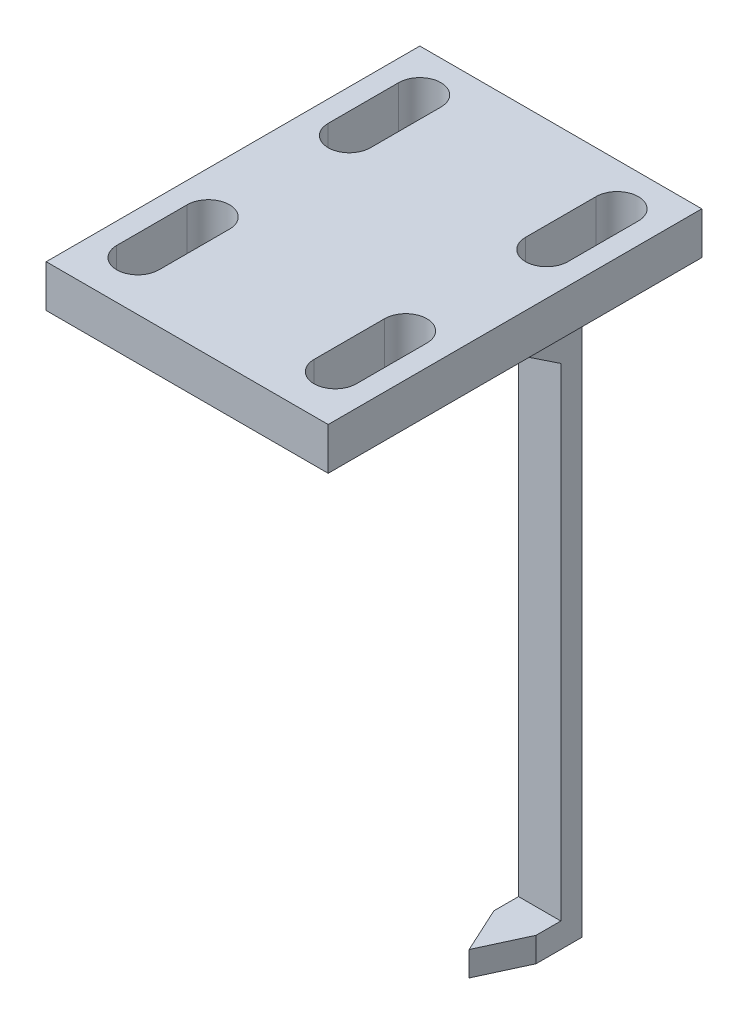
ISO-10303-21;
HEADER;
FILE_DESCRIPTION(('STEP AP214'),'2;1');
FILE_NAME('part.step','',(''),(''),'','','');
FILE_SCHEMA(('AUTOMOTIVE_DESIGN { 1 0 10303 214 1 1 1 1 }'));
ENDSEC;
DATA;
#1=APPLICATION_CONTEXT('core data for automotive mechanical design processes');
#2=APPLICATION_PROTOCOL_DEFINITION('international standard','automotive_design',2000,#1);
#3=PRODUCT_CONTEXT('',#1,'mechanical');
#4=PRODUCT('Part','Part','',(#3));
#5=PRODUCT_RELATED_PRODUCT_CATEGORY('part','',(#4));
#6=PRODUCT_DEFINITION_FORMATION('','',#4);
#7=PRODUCT_DEFINITION_CONTEXT('part definition',#1,'design');
#8=PRODUCT_DEFINITION('design','',#6,#7);
#9=PRODUCT_DEFINITION_SHAPE('','',#8);
#10=(LENGTH_UNIT() NAMED_UNIT(*) SI_UNIT(.MILLI.,.METRE.));
#11=(NAMED_UNIT(*) PLANE_ANGLE_UNIT() SI_UNIT($,.RADIAN.));
#12=(NAMED_UNIT(*) SI_UNIT($,.STERADIAN.) SOLID_ANGLE_UNIT());
#13=UNCERTAINTY_MEASURE_WITH_UNIT(LENGTH_MEASURE(1.E-05),#10,'distance_accuracy_value','');
#14=(GEOMETRIC_REPRESENTATION_CONTEXT(3) GLOBAL_UNCERTAINTY_ASSIGNED_CONTEXT((#13)) GLOBAL_UNIT_ASSIGNED_CONTEXT((#10,
#11,#12)) REPRESENTATION_CONTEXT('',''));
#15=CARTESIAN_POINT('',(0.,0.,0.));
#16=DIRECTION('',(0.,0.,1.));
#17=DIRECTION('',(1.,0.,0.));
#18=AXIS2_PLACEMENT_3D('',#15,#16,#17);
#19=CARTESIAN_POINT('',(-8.5,46.,1.5));
#20=DIRECTION('',(0.,1.,0.));
#21=DIRECTION('',(0.,0.,1.));
#22=AXIS2_PLACEMENT_3D('',#19,#20,#21);
#23=PLANE('',#22);
#24=DIRECTION('',(0.,0.,-1.));
#25=VECTOR('',#24,1.);
#26=CARTESIAN_POINT('',(7.,46.,8.));
#27=LINE('',#26,#25);
#28=CARTESIAN_POINT('',(7.,46.,8.));
#29=VERTEX_POINT('',#28);
#30=CARTESIAN_POINT('',(7.,46.,3.));
#31=VERTEX_POINT('',#30);
#32=EDGE_CURVE('E367',#29,#31,#27,.T.);
#33=ORIENTED_EDGE('',*,*,#32,.F.);
#34=CARTESIAN_POINT('',(8.5,46.,8.));
#35=DIRECTION('',(0.,-1.,0.));
#36=DIRECTION('',(0.,0.,-1.));
#37=AXIS2_PLACEMENT_3D('',#34,#35,#36);
#38=CIRCLE('',#37,1.5);
#39=CARTESIAN_POINT('',(10.,46.,8.));
#40=VERTEX_POINT('',#39);
#41=EDGE_CURVE('E370',#40,#29,#38,.T.);
#42=ORIENTED_EDGE('',*,*,#41,.F.);
#43=DIRECTION('',(0.,0.,1.));
#44=VECTOR('',#43,1.);
#45=CARTESIAN_POINT('',(10.,46.,8.));
#46=LINE('',#45,#44);
#47=CARTESIAN_POINT('',(10.,46.,3.));
#48=VERTEX_POINT('',#47);
#49=EDGE_CURVE('E357',#48,#40,#46,.T.);
#50=ORIENTED_EDGE('',*,*,#49,.F.);
#51=CARTESIAN_POINT('',(8.5,46.,3.));
#52=DIRECTION('',(0.,-1.,0.));
#53=DIRECTION('',(0.,0.,-1.));
#54=AXIS2_PLACEMENT_3D('',#51,#52,#53);
#55=CIRCLE('',#54,1.5);
#56=EDGE_CURVE('E364',#31,#48,#55,.T.);
#57=ORIENTED_EDGE('',*,*,#56,.F.);
#58=EDGE_LOOP('',(#33,#42,#50,#57));
#59=FACE_BOUND('',#58,.T.);
#60=DIRECTION('',(0.,0.,-1.));
#61=VECTOR('',#60,1.);
#62=CARTESIAN_POINT('',(-7.00000000000006,46.,23.));
#63=LINE('',#62,#61);
#64=CARTESIAN_POINT('',(-7.00000000000006,46.,23.));
#65=VERTEX_POINT('',#64);
#66=CARTESIAN_POINT('',(-7.00000000000005,46.,18.));
#67=VERTEX_POINT('',#66);
#68=EDGE_CURVE('E425',#65,#67,#63,.T.);
#69=ORIENTED_EDGE('',*,*,#68,.F.);
#70=CARTESIAN_POINT('',(-5.50000000000005,46.,23.));
#71=DIRECTION('',(0.,-1.,0.));
#72=DIRECTION('',(0.,0.,-1.));
#73=AXIS2_PLACEMENT_3D('',#70,#71,#72);
#74=CIRCLE('',#73,1.5);
#75=CARTESIAN_POINT('',(-4.00000000000005,46.,23.));
#76=VERTEX_POINT('',#75);
#77=EDGE_CURVE('E428',#76,#65,#74,.T.);
#78=ORIENTED_EDGE('',*,*,#77,.F.);
#79=DIRECTION('',(0.,0.,1.));
#80=VECTOR('',#79,1.);
#81=CARTESIAN_POINT('',(-4.00000000000005,46.,23.));
#82=LINE('',#81,#80);
#83=CARTESIAN_POINT('',(-4.00000000000006,46.,18.));
#84=VERTEX_POINT('',#83);
#85=EDGE_CURVE('E413',#84,#76,#82,.T.);
#86=ORIENTED_EDGE('',*,*,#85,.F.);
#87=CARTESIAN_POINT('',(-5.50000000000005,46.,18.));
#88=DIRECTION('',(0.,-1.,0.));
#89=DIRECTION('',(0.,0.,-1.));
#90=AXIS2_PLACEMENT_3D('',#87,#88,#89);
#91=CIRCLE('',#90,1.5);
#92=EDGE_CURVE('E422',#67,#84,#91,.T.);
#93=ORIENTED_EDGE('',*,*,#92,.F.);
#94=EDGE_LOOP('',(#69,#78,#86,#93));
#95=FACE_BOUND('',#94,.T.);
#96=DIRECTION('',(0.,0.,-1.));
#97=VECTOR('',#96,1.);
#98=CARTESIAN_POINT('',(6.99999999999995,46.,23.));
#99=LINE('',#98,#97);
#100=CARTESIAN_POINT('',(6.99999999999995,46.,23.));
#101=VERTEX_POINT('',#100);
#102=CARTESIAN_POINT('',(6.99999999999995,46.,18.));
#103=VERTEX_POINT('',#102);
#104=EDGE_CURVE('E446',#101,#103,#99,.T.);
#105=ORIENTED_EDGE('',*,*,#104,.F.);
#106=CARTESIAN_POINT('',(8.49999999999994,46.,23.));
#107=DIRECTION('',(0.,-1.,0.));
#108=DIRECTION('',(0.,0.,-1.));
#109=AXIS2_PLACEMENT_3D('',#106,#107,#108);
#110=CIRCLE('',#109,1.5);
#111=CARTESIAN_POINT('',(9.99999999999995,46.,23.));
#112=VERTEX_POINT('',#111);
#113=EDGE_CURVE('E419',#112,#101,#110,.T.);
#114=ORIENTED_EDGE('',*,*,#113,.F.);
#115=DIRECTION('',(0.,0.,1.));
#116=VECTOR('',#115,1.);
#117=CARTESIAN_POINT('',(9.99999999999995,46.,23.));
#118=LINE('',#117,#116);
#119=CARTESIAN_POINT('',(9.99999999999995,46.,18.));
#120=VERTEX_POINT('',#119);
#121=EDGE_CURVE('E434',#120,#112,#118,.T.);
#122=ORIENTED_EDGE('',*,*,#121,.F.);
#123=CARTESIAN_POINT('',(8.49999999999994,46.,18.));
#124=DIRECTION('',(0.,-1.,0.));
#125=DIRECTION('',(0.,0.,-1.));
#126=AXIS2_PLACEMENT_3D('',#123,#124,#125);
#127=CIRCLE('',#126,1.5);
#128=EDGE_CURVE('E443',#103,#120,#127,.T.);
#129=ORIENTED_EDGE('',*,*,#128,.F.);
#130=EDGE_LOOP('',(#105,#114,#122,#129));
#131=FACE_BOUND('',#130,.T.);
#132=DIRECTION('',(0.,0.,-1.));
#133=VECTOR('',#132,1.);
#134=CARTESIAN_POINT('',(-7.,46.,8.));
#135=LINE('',#134,#133);
#136=CARTESIAN_POINT('',(-7.,46.,8.));
#137=VERTEX_POINT('',#136);
#138=CARTESIAN_POINT('',(-7.,46.,3.));
#139=VERTEX_POINT('',#138);
#140=EDGE_CURVE('E463',#137,#139,#135,.T.);
#141=ORIENTED_EDGE('',*,*,#140,.F.);
#142=CARTESIAN_POINT('',(-5.5,46.,8.));
#143=DIRECTION('',(0.,-1.,0.));
#144=DIRECTION('',(0.,0.,-1.));
#145=AXIS2_PLACEMENT_3D('',#142,#143,#144);
#146=CIRCLE('',#145,1.5);
#147=CARTESIAN_POINT('',(-4.,46.,8.));
#148=VERTEX_POINT('',#147);
#149=EDGE_CURVE('E440',#148,#137,#146,.T.);
#150=ORIENTED_EDGE('',*,*,#149,.F.);
#151=DIRECTION('',(0.,0.,1.));
#152=VECTOR('',#151,1.);
#153=CARTESIAN_POINT('',(-4.,46.,8.));
#154=LINE('',#153,#152);
#155=CARTESIAN_POINT('',(-4.,46.,3.));
#156=VERTEX_POINT('',#155);
#157=EDGE_CURVE('E453',#156,#148,#154,.T.);
#158=ORIENTED_EDGE('',*,*,#157,.F.);
#159=CARTESIAN_POINT('',(-5.5,46.,3.));
#160=DIRECTION('',(0.,-1.,0.));
#161=DIRECTION('',(0.,0.,-1.));
#162=AXIS2_PLACEMENT_3D('',#159,#160,#161);
#163=CIRCLE('',#162,1.5);
#164=EDGE_CURVE('E460',#139,#156,#163,.T.);
#165=ORIENTED_EDGE('',*,*,#164,.F.);
#166=EDGE_LOOP('',(#141,#150,#158,#165));
#167=FACE_BOUND('',#166,.T.);
#168=DIRECTION('',(-1.,0.,0.));
#169=VECTOR('',#168,1.);
#170=CARTESIAN_POINT('',(3.,46.,16.5));
#171=LINE('',#170,#169);
#172=CARTESIAN_POINT('',(3.,46.,16.5));
#173=VERTEX_POINT('',#172);
#174=CARTESIAN_POINT('',(0.,46.,16.5));
#175=VERTEX_POINT('',#174);
#176=EDGE_CURVE('E229',#173,#175,#171,.T.);
#177=ORIENTED_EDGE('',*,*,#176,.F.);
#178=DIRECTION('',(0.,0.,-1.));
#179=VECTOR('',#178,1.);
#180=CARTESIAN_POINT('',(3.,46.,1.5));
#181=LINE('',#180,#179);
#182=CARTESIAN_POINT('',(3.,46.,0.));
#183=VERTEX_POINT('',#182);
#184=EDGE_CURVE('E237',#173,#183,#181,.T.);
#185=ORIENTED_EDGE('',*,*,#184,.T.);
#186=DIRECTION('',(1.,0.,0.));
#187=VECTOR('',#186,1.);
#188=CARTESIAN_POINT('',(3.,46.,0.));
#189=LINE('',#188,#187);
#190=CARTESIAN_POINT('',(11.5,46.,0.));
#191=VERTEX_POINT('',#190);
#192=EDGE_CURVE('E260',#183,#191,#189,.T.);
#193=ORIENTED_EDGE('',*,*,#192,.T.);
#194=DIRECTION('',(0.,0.,-1.));
#195=VECTOR('',#194,1.);
#196=CARTESIAN_POINT('',(11.5,46.,1.5));
#197=LINE('',#196,#195);
#198=CARTESIAN_POINT('',(11.5,46.,26.5));
#199=VERTEX_POINT('',#198);
#200=EDGE_CURVE('E277',#199,#191,#197,.T.);
#201=ORIENTED_EDGE('',*,*,#200,.F.);
#202=DIRECTION('',(1.,0.,0.));
#203=VECTOR('',#202,1.);
#204=CARTESIAN_POINT('',(-8.5,46.,26.5));
#205=LINE('',#204,#203);
#206=CARTESIAN_POINT('',(-8.5,46.,26.5));
#207=VERTEX_POINT('',#206);
#208=EDGE_CURVE('E307',#207,#199,#205,.T.);
#209=ORIENTED_EDGE('',*,*,#208,.F.);
#210=DIRECTION('',(0.,0.,-1.));
#211=VECTOR('',#210,1.);
#212=CARTESIAN_POINT('',(-8.5,46.,1.5));
#213=LINE('',#212,#211);
#214=CARTESIAN_POINT('',(-8.5,46.,0.));
#215=VERTEX_POINT('',#214);
#216=EDGE_CURVE('E245',#207,#215,#213,.T.);
#217=ORIENTED_EDGE('',*,*,#216,.T.);
#218=DIRECTION('',(1.,0.,0.));
#219=VECTOR('',#218,1.);
#220=CARTESIAN_POINT('',(-8.5,46.,0.));
#221=LINE('',#220,#219);
#222=CARTESIAN_POINT('',(0.,46.,0.));
#223=VERTEX_POINT('',#222);
#224=EDGE_CURVE('E247',#215,#223,#221,.T.);
#225=ORIENTED_EDGE('',*,*,#224,.T.);
#226=DIRECTION('',(0.,0.,-1.));
#227=VECTOR('',#226,1.);
#228=CARTESIAN_POINT('',(0.,46.,1.5));
#229=LINE('',#228,#227);
#230=EDGE_CURVE('E50',#175,#223,#229,.T.);
#231=ORIENTED_EDGE('',*,*,#230,.F.);
#232=EDGE_LOOP('',(#177,#185,#193,#201,#209,#217,#225,#231));
#233=FACE_BOUND('',#232,.T.);
#234=ADVANCED_FACE('F35',(#59,#95,#131,#167,#233),#23,.F.);
#235=CARTESIAN_POINT('',(0.,0.,1.5));
#236=DIRECTION('',(0.,0.,-1.));
#237=DIRECTION('',(-1.,0.,0.));
#238=AXIS2_PLACEMENT_3D('',#235,#236,#237);
#239=PLANE('',#238);
#240=DIRECTION('',(0.,1.,0.));
#241=VECTOR('',#240,1.);
#242=CARTESIAN_POINT('',(3.,0.,1.5));
#243=LINE('',#242,#241);
#244=CARTESIAN_POINT('',(3.,1.75092639848559,1.5));
#245=VERTEX_POINT('',#244);
#246=CARTESIAN_POINT('',(3.,36.,1.5));
#247=VERTEX_POINT('',#246);
#248=EDGE_CURVE('E235',#245,#247,#243,.T.);
#249=ORIENTED_EDGE('',*,*,#248,.T.);
#250=DIRECTION('',(-1.,0.,0.));
#251=VECTOR('',#250,1.);
#252=CARTESIAN_POINT('',(3.,36.,1.5));
#253=LINE('',#252,#251);
#254=CARTESIAN_POINT('',(0.,36.,1.5));
#255=VERTEX_POINT('',#254);
#256=EDGE_CURVE('E220',#247,#255,#253,.T.);
#257=ORIENTED_EDGE('',*,*,#256,.T.);
#258=DIRECTION('',(0.,-1.,0.));
#259=VECTOR('',#258,1.);
#260=CARTESIAN_POINT('',(0.,0.,1.5));
#261=LINE('',#260,#259);
#262=CARTESIAN_POINT('',(0.,1.75092639848559,1.5));
#263=VERTEX_POINT('',#262);
#264=EDGE_CURVE('E243',#255,#263,#261,.T.);
#265=ORIENTED_EDGE('',*,*,#264,.T.);
#266=DIRECTION('',(-1.,0.,0.));
#267=VECTOR('',#266,1.);
#268=CARTESIAN_POINT('',(0.,1.75092639848559,1.5));
#269=LINE('',#268,#267);
#270=EDGE_CURVE('E242',#245,#263,#269,.T.);
#271=ORIENTED_EDGE('',*,*,#270,.F.);
#272=EDGE_LOOP('',(#249,#257,#265,#271));
#273=FACE_BOUND('',#272,.T.);
#274=ADVANCED_FACE('F240',(#273),#239,.F.);
#275=CARTESIAN_POINT('',(0.,0.,1.5));
#276=DIRECTION('',(1.,0.,0.));
#277=DIRECTION('',(0.,0.,-1.));
#278=AXIS2_PLACEMENT_3D('',#275,#276,#277);
#279=PLANE('',#278);
#280=DIRECTION('',(0.,0.,-1.));
#281=VECTOR('',#280,1.);
#282=CARTESIAN_POINT('',(0.,0.,1.5));
#283=LINE('',#282,#281);
#284=CARTESIAN_POINT('',(0.,0.,3.25));
#285=VERTEX_POINT('',#284);
#286=CARTESIAN_POINT('',(0.,0.,0.));
#287=VERTEX_POINT('',#286);
#288=EDGE_CURVE('E11',#285,#287,#283,.T.);
#289=ORIENTED_EDGE('',*,*,#288,.F.);
#290=DIRECTION('',(0.,-1.,0.));
#291=VECTOR('',#290,1.);
#292=CARTESIAN_POINT('',(0.,5.,3.25));
#293=LINE('',#292,#291);
#294=CARTESIAN_POINT('',(0.,1.75092639848559,3.25));
#295=VERTEX_POINT('',#294);
#296=EDGE_CURVE('E332',#295,#285,#293,.T.);
#297=ORIENTED_EDGE('',*,*,#296,.F.);
#298=DIRECTION('',(0.,0.,-1.));
#299=VECTOR('',#298,1.);
#300=CARTESIAN_POINT('',(0.,1.75092639848559,6.5));
#301=LINE('',#300,#299);
#302=EDGE_CURVE('E315',#295,#263,#301,.T.);
#303=ORIENTED_EDGE('',*,*,#302,.T.);
#304=ORIENTED_EDGE('',*,*,#264,.F.);
#305=DIRECTION('',(0.,0.554700196225229,0.832050294337844));
#306=VECTOR('',#305,1.);
#307=CARTESIAN_POINT('',(0.,36.,1.5));
#308=LINE('',#307,#306);
#309=EDGE_CURVE('E225',#255,#175,#308,.T.);
#310=ORIENTED_EDGE('',*,*,#309,.T.);
#311=ORIENTED_EDGE('',*,*,#230,.T.);
#312=DIRECTION('',(0.,-1.,0.));
#313=VECTOR('',#312,1.);
#314=CARTESIAN_POINT('',(0.,0.,0.));
#315=LINE('',#314,#313);
#316=EDGE_CURVE('E251',#223,#287,#315,.T.);
#317=ORIENTED_EDGE('',*,*,#316,.T.);
#318=EDGE_LOOP('',(#289,#297,#303,#304,#310,#311,#317));
#319=FACE_BOUND('',#318,.T.);
#320=ADVANCED_FACE('F37',(#319),#279,.F.);
#321=CARTESIAN_POINT('',(0.,0.,1.5));
#322=DIRECTION('',(0.,1.,0.));
#323=DIRECTION('',(0.,0.,1.));
#324=AXIS2_PLACEMENT_3D('',#321,#322,#323);
#325=PLANE('',#324);
#326=DIRECTION('',(0.,0.,-1.));
#327=VECTOR('',#326,1.);
#328=CARTESIAN_POINT('',(3.,0.,1.5));
#329=LINE('',#328,#327);
#330=CARTESIAN_POINT('',(3.,0.,3.25));
#331=VERTEX_POINT('',#330);
#332=CARTESIAN_POINT('',(3.,0.,0.));
#333=VERTEX_POINT('',#332);
#334=EDGE_CURVE('E43',#331,#333,#329,.T.);
#335=ORIENTED_EDGE('',*,*,#334,.F.);
#336=DIRECTION('',(0.419058177461747,0.,-0.907959384500452));
#337=VECTOR('',#336,1.);
#338=CARTESIAN_POINT('',(3.,0.,3.25));
#339=LINE('',#338,#337);
#340=CARTESIAN_POINT('',(1.5,0.,6.5));
#341=VERTEX_POINT('',#340);
#342=EDGE_CURVE('E338',#341,#331,#339,.T.);
#343=ORIENTED_EDGE('',*,*,#342,.F.);
#344=DIRECTION('',(0.419058177461747,0.,0.907959384500452));
#345=VECTOR('',#344,1.);
#346=CARTESIAN_POINT('',(1.5,0.,6.5));
#347=LINE('',#346,#345);
#348=EDGE_CURVE('E333',#285,#341,#347,.T.);
#349=ORIENTED_EDGE('',*,*,#348,.F.);
#350=ORIENTED_EDGE('',*,*,#288,.T.);
#351=DIRECTION('',(1.,0.,0.));
#352=VECTOR('',#351,1.);
#353=CARTESIAN_POINT('',(0.,0.,0.));
#354=LINE('',#353,#352);
#355=EDGE_CURVE('E254',#287,#333,#354,.T.);
#356=ORIENTED_EDGE('',*,*,#355,.T.);
#357=EDGE_LOOP('',(#335,#343,#349,#350,#356));
#358=FACE_BOUND('',#357,.T.);
#359=ADVANCED_FACE('F287',(#358),#325,.F.);
#360=CARTESIAN_POINT('',(3.,0.,1.5));
#361=DIRECTION('',(-1.,0.,0.));
#362=DIRECTION('',(0.,-1.,0.));
#363=AXIS2_PLACEMENT_3D('',#360,#361,#362);
#364=PLANE('',#363);
#365=DIRECTION('',(0.,0.,-1.));
#366=VECTOR('',#365,1.);
#367=CARTESIAN_POINT('',(3.,1.75092639848559,6.5));
#368=LINE('',#367,#366);
#369=CARTESIAN_POINT('',(3.,1.75092639848559,3.25));
#370=VERTEX_POINT('',#369);
#371=EDGE_CURVE('E255',#370,#245,#368,.T.);
#372=ORIENTED_EDGE('',*,*,#371,.F.);
#373=DIRECTION('',(0.,-1.,0.));
#374=VECTOR('',#373,1.);
#375=CARTESIAN_POINT('',(3.,5.,3.25));
#376=LINE('',#375,#374);
#377=EDGE_CURVE('E283',#370,#331,#376,.T.);
#378=ORIENTED_EDGE('',*,*,#377,.T.);
#379=ORIENTED_EDGE('',*,*,#334,.T.);
#380=DIRECTION('',(0.,1.,0.));
#381=VECTOR('',#380,1.);
#382=CARTESIAN_POINT('',(3.,0.,0.));
#383=LINE('',#382,#381);
#384=EDGE_CURVE('E258',#333,#183,#383,.T.);
#385=ORIENTED_EDGE('',*,*,#384,.T.);
#386=ORIENTED_EDGE('',*,*,#184,.F.);
#387=DIRECTION('',(0.,0.554700196225229,0.832050294337844));
#388=VECTOR('',#387,1.);
#389=CARTESIAN_POINT('',(3.,36.,1.5));
#390=LINE('',#389,#388);
#391=EDGE_CURVE('E224',#247,#173,#390,.T.);
#392=ORIENTED_EDGE('',*,*,#391,.F.);
#393=ORIENTED_EDGE('',*,*,#248,.F.);
#394=EDGE_LOOP('',(#372,#378,#379,#385,#386,#392,#393));
#395=FACE_BOUND('',#394,.T.);
#396=ADVANCED_FACE('F234',(#395),#364,.F.);
#397=CARTESIAN_POINT('',(11.5,49.,1.5));
#398=DIRECTION('',(-1.,0.,0.));
#399=DIRECTION('',(0.,-1.,0.));
#400=AXIS2_PLACEMENT_3D('',#397,#398,#399);
#401=PLANE('',#400);
#402=DIRECTION('',(0.,1.,0.));
#403=VECTOR('',#402,1.);
#404=CARTESIAN_POINT('',(11.5,49.,0.));
#405=LINE('',#404,#403);
#406=CARTESIAN_POINT('',(11.5,49.,0.));
#407=VERTEX_POINT('',#406);
#408=EDGE_CURVE('E262',#191,#407,#405,.T.);
#409=ORIENTED_EDGE('',*,*,#408,.T.);
#410=DIRECTION('',(0.,0.,-1.));
#411=VECTOR('',#410,1.);
#412=CARTESIAN_POINT('',(11.5,49.,1.5));
#413=LINE('',#412,#411);
#414=CARTESIAN_POINT('',(11.5,49.,26.5));
#415=VERTEX_POINT('',#414);
#416=EDGE_CURVE('E274',#415,#407,#413,.T.);
#417=ORIENTED_EDGE('',*,*,#416,.F.);
#418=DIRECTION('',(0.,1.,0.));
#419=VECTOR('',#418,1.);
#420=CARTESIAN_POINT('',(11.5,49.,26.5));
#421=LINE('',#420,#419);
#422=EDGE_CURVE('E302',#199,#415,#421,.T.);
#423=ORIENTED_EDGE('',*,*,#422,.F.);
#424=ORIENTED_EDGE('',*,*,#200,.T.);
#425=EDGE_LOOP('',(#409,#417,#423,#424));
#426=FACE_BOUND('',#425,.T.);
#427=ADVANCED_FACE('F300',(#426),#401,.F.);
#428=CARTESIAN_POINT('',(-8.5,49.,1.5));
#429=DIRECTION('',(0.,-1.,0.));
#430=DIRECTION('',(0.,0.,-1.));
#431=AXIS2_PLACEMENT_3D('',#428,#429,#430);
#432=PLANE('',#431);
#433=DIRECTION('',(0.,0.,1.));
#434=VECTOR('',#433,1.);
#435=CARTESIAN_POINT('',(-4.,49.,1.5));
#436=LINE('',#435,#434);
#437=CARTESIAN_POINT('',(-4.,49.,3.));
#438=VERTEX_POINT('',#437);
#439=CARTESIAN_POINT('',(-4.,49.,8.));
#440=VERTEX_POINT('',#439);
#441=EDGE_CURVE('E375',#438,#440,#436,.T.);
#442=ORIENTED_EDGE('',*,*,#441,.T.);
#443=CARTESIAN_POINT('',(-5.5,49.,8.));
#444=DIRECTION('',(0.,-1.,0.));
#445=DIRECTION('',(0.,0.,-1.));
#446=AXIS2_PLACEMENT_3D('',#443,#444,#445);
#447=CIRCLE('',#446,1.5);
#448=CARTESIAN_POINT('',(-7.,49.,8.));
#449=VERTEX_POINT('',#448);
#450=EDGE_CURVE('E372',#440,#449,#447,.T.);
#451=ORIENTED_EDGE('',*,*,#450,.T.);
#452=DIRECTION('',(0.,0.,-1.));
#453=VECTOR('',#452,1.);
#454=CARTESIAN_POINT('',(-7.,49.,1.5));
#455=LINE('',#454,#453);
#456=CARTESIAN_POINT('',(-7.,49.,3.));
#457=VERTEX_POINT('',#456);
#458=EDGE_CURVE('E381',#449,#457,#455,.T.);
#459=ORIENTED_EDGE('',*,*,#458,.T.);
#460=CARTESIAN_POINT('',(-5.5,49.,3.));
#461=DIRECTION('',(0.,-1.,0.));
#462=DIRECTION('',(0.,0.,-1.));
#463=AXIS2_PLACEMENT_3D('',#460,#461,#462);
#464=CIRCLE('',#463,1.5);
#465=EDGE_CURVE('E378',#457,#438,#464,.T.);
#466=ORIENTED_EDGE('',*,*,#465,.T.);
#467=EDGE_LOOP('',(#442,#451,#459,#466));
#468=FACE_BOUND('',#467,.T.);
#469=DIRECTION('',(0.,0.,1.));
#470=VECTOR('',#469,1.);
#471=CARTESIAN_POINT('',(9.99999999999995,49.,1.5));
#472=LINE('',#471,#470);
#473=CARTESIAN_POINT('',(9.99999999999995,49.,18.));
#474=VERTEX_POINT('',#473);
#475=CARTESIAN_POINT('',(9.99999999999995,49.,23.));
#476=VERTEX_POINT('',#475);
#477=EDGE_CURVE('E387',#474,#476,#472,.T.);
#478=ORIENTED_EDGE('',*,*,#477,.T.);
#479=CARTESIAN_POINT('',(8.49999999999994,49.,23.));
#480=DIRECTION('',(0.,-1.,0.));
#481=DIRECTION('',(0.,0.,-1.));
#482=AXIS2_PLACEMENT_3D('',#479,#480,#481);
#483=CIRCLE('',#482,1.5);
#484=CARTESIAN_POINT('',(6.99999999999995,49.,23.));
#485=VERTEX_POINT('',#484);
#486=EDGE_CURVE('E384',#476,#485,#483,.T.);
#487=ORIENTED_EDGE('',*,*,#486,.T.);
#488=DIRECTION('',(0.,0.,-1.));
#489=VECTOR('',#488,1.);
#490=CARTESIAN_POINT('',(6.99999999999995,49.,1.5));
#491=LINE('',#490,#489);
#492=CARTESIAN_POINT('',(6.99999999999995,49.,18.));
#493=VERTEX_POINT('',#492);
#494=EDGE_CURVE('E393',#485,#493,#491,.T.);
#495=ORIENTED_EDGE('',*,*,#494,.T.);
#496=CARTESIAN_POINT('',(8.49999999999994,49.,18.));
#497=DIRECTION('',(0.,-1.,0.));
#498=DIRECTION('',(0.,0.,-1.));
#499=AXIS2_PLACEMENT_3D('',#496,#497,#498);
#500=CIRCLE('',#499,1.5);
#501=EDGE_CURVE('E390',#493,#474,#500,.T.);
#502=ORIENTED_EDGE('',*,*,#501,.T.);
#503=EDGE_LOOP('',(#478,#487,#495,#502));
#504=FACE_BOUND('',#503,.T.);
#505=DIRECTION('',(0.,0.,1.));
#506=VECTOR('',#505,1.);
#507=CARTESIAN_POINT('',(-4.00000000000006,49.,1.5));
#508=LINE('',#507,#506);
#509=CARTESIAN_POINT('',(-4.00000000000006,49.,18.));
#510=VERTEX_POINT('',#509);
#511=CARTESIAN_POINT('',(-4.00000000000005,49.,23.));
#512=VERTEX_POINT('',#511);
#513=EDGE_CURVE('E399',#510,#512,#508,.T.);
#514=ORIENTED_EDGE('',*,*,#513,.T.);
#515=CARTESIAN_POINT('',(-5.50000000000005,49.,23.));
#516=DIRECTION('',(0.,-1.,0.));
#517=DIRECTION('',(0.,0.,-1.));
#518=AXIS2_PLACEMENT_3D('',#515,#516,#517);
#519=CIRCLE('',#518,1.5);
#520=CARTESIAN_POINT('',(-7.00000000000006,49.,23.));
#521=VERTEX_POINT('',#520);
#522=EDGE_CURVE('E396',#512,#521,#519,.T.);
#523=ORIENTED_EDGE('',*,*,#522,.T.);
#524=DIRECTION('',(0.,0.,-1.));
#525=VECTOR('',#524,1.);
#526=CARTESIAN_POINT('',(-7.00000000000005,49.,1.5));
#527=LINE('',#526,#525);
#528=CARTESIAN_POINT('',(-7.00000000000005,49.,18.));
#529=VERTEX_POINT('',#528);
#530=EDGE_CURVE('E405',#521,#529,#527,.T.);
#531=ORIENTED_EDGE('',*,*,#530,.T.);
#532=CARTESIAN_POINT('',(-5.50000000000005,49.,18.));
#533=DIRECTION('',(0.,-1.,0.));
#534=DIRECTION('',(0.,0.,-1.));
#535=AXIS2_PLACEMENT_3D('',#532,#533,#534);
#536=CIRCLE('',#535,1.5);
#537=EDGE_CURVE('E402',#529,#510,#536,.T.);
#538=ORIENTED_EDGE('',*,*,#537,.T.);
#539=EDGE_LOOP('',(#514,#523,#531,#538));
#540=FACE_BOUND('',#539,.T.);
#541=DIRECTION('',(0.,0.,1.));
#542=VECTOR('',#541,1.);
#543=CARTESIAN_POINT('',(10.,49.,1.5));
#544=LINE('',#543,#542);
#545=CARTESIAN_POINT('',(10.,49.,3.));
#546=VERTEX_POINT('',#545);
#547=CARTESIAN_POINT('',(10.,49.,8.));
#548=VERTEX_POINT('',#547);
#549=EDGE_CURVE('E343',#546,#548,#544,.T.);
#550=ORIENTED_EDGE('',*,*,#549,.T.);
#551=CARTESIAN_POINT('',(8.5,49.,8.));
#552=DIRECTION('',(0.,-1.,0.));
#553=DIRECTION('',(0.,0.,-1.));
#554=AXIS2_PLACEMENT_3D('',#551,#552,#553);
#555=CIRCLE('',#554,1.5);
#556=CARTESIAN_POINT('',(7.,49.,8.));
#557=VERTEX_POINT('',#556);
#558=EDGE_CURVE('E340',#548,#557,#555,.T.);
#559=ORIENTED_EDGE('',*,*,#558,.T.);
#560=DIRECTION('',(0.,0.,-1.));
#561=VECTOR('',#560,1.);
#562=CARTESIAN_POINT('',(7.,49.,1.5));
#563=LINE('',#562,#561);
#564=CARTESIAN_POINT('',(7.,49.,3.));
#565=VERTEX_POINT('',#564);
#566=EDGE_CURVE('E349',#557,#565,#563,.T.);
#567=ORIENTED_EDGE('',*,*,#566,.T.);
#568=CARTESIAN_POINT('',(8.5,49.,3.));
#569=DIRECTION('',(0.,-1.,0.));
#570=DIRECTION('',(0.,0.,-1.));
#571=AXIS2_PLACEMENT_3D('',#568,#569,#570);
#572=CIRCLE('',#571,1.5);
#573=EDGE_CURVE('E346',#565,#546,#572,.T.);
#574=ORIENTED_EDGE('',*,*,#573,.T.);
#575=EDGE_LOOP('',(#550,#559,#567,#574));
#576=FACE_BOUND('',#575,.T.);
#577=DIRECTION('',(-1.,0.,0.));
#578=VECTOR('',#577,1.);
#579=CARTESIAN_POINT('',(-8.5,49.,0.));
#580=LINE('',#579,#578);
#581=CARTESIAN_POINT('',(-8.5,49.,0.));
#582=VERTEX_POINT('',#581);
#583=EDGE_CURVE('E264',#407,#582,#580,.T.);
#584=ORIENTED_EDGE('',*,*,#583,.T.);
#585=DIRECTION('',(0.,0.,-1.));
#586=VECTOR('',#585,1.);
#587=CARTESIAN_POINT('',(-8.5,49.,1.5));
#588=LINE('',#587,#586);
#589=CARTESIAN_POINT('',(-8.5,49.,26.5));
#590=VERTEX_POINT('',#589);
#591=EDGE_CURVE('E271',#590,#582,#588,.T.);
#592=ORIENTED_EDGE('',*,*,#591,.F.);
#593=DIRECTION('',(-1.,0.,0.));
#594=VECTOR('',#593,1.);
#595=CARTESIAN_POINT('',(-8.5,49.,26.5));
#596=LINE('',#595,#594);
#597=EDGE_CURVE('E306',#415,#590,#596,.T.);
#598=ORIENTED_EDGE('',*,*,#597,.F.);
#599=ORIENTED_EDGE('',*,*,#416,.T.);
#600=EDGE_LOOP('',(#584,#592,#598,#599));
#601=FACE_BOUND('',#600,.T.);
#602=ADVANCED_FACE('F496',(#468,#504,#540,#576,#601),#432,.F.);
#603=CARTESIAN_POINT('',(-8.5,49.,1.5));
#604=DIRECTION('',(1.,0.,0.));
#605=DIRECTION('',(0.,1.,0.));
#606=AXIS2_PLACEMENT_3D('',#603,#604,#605);
#607=PLANE('',#606);
#608=DIRECTION('',(0.,-1.,0.));
#609=VECTOR('',#608,1.);
#610=CARTESIAN_POINT('',(-8.5,49.,0.));
#611=LINE('',#610,#609);
#612=EDGE_CURVE('E266',#582,#215,#611,.T.);
#613=ORIENTED_EDGE('',*,*,#612,.T.);
#614=ORIENTED_EDGE('',*,*,#216,.F.);
#615=DIRECTION('',(0.,-1.,0.));
#616=VECTOR('',#615,1.);
#617=CARTESIAN_POINT('',(-8.5,49.,26.5));
#618=LINE('',#617,#616);
#619=EDGE_CURVE('E310',#590,#207,#618,.T.);
#620=ORIENTED_EDGE('',*,*,#619,.F.);
#621=ORIENTED_EDGE('',*,*,#591,.T.);
#622=EDGE_LOOP('',(#613,#614,#620,#621));
#623=FACE_BOUND('',#622,.T.);
#624=ADVANCED_FACE('F493',(#623),#607,.F.);
#625=CARTESIAN_POINT('',(0.,0.,0.));
#626=DIRECTION('',(0.,0.,-1.));
#627=DIRECTION('',(-1.,0.,0.));
#628=AXIS2_PLACEMENT_3D('',#625,#626,#627);
#629=PLANE('',#628);
#630=ORIENTED_EDGE('',*,*,#316,.F.);
#631=ORIENTED_EDGE('',*,*,#224,.F.);
#632=ORIENTED_EDGE('',*,*,#612,.F.);
#633=ORIENTED_EDGE('',*,*,#583,.F.);
#634=ORIENTED_EDGE('',*,*,#408,.F.);
#635=ORIENTED_EDGE('',*,*,#192,.F.);
#636=ORIENTED_EDGE('',*,*,#384,.F.);
#637=ORIENTED_EDGE('',*,*,#355,.F.);
#638=EDGE_LOOP('',(#630,#631,#632,#633,#634,#635,#636,#637));
#639=FACE_BOUND('',#638,.T.);
#640=ADVANCED_FACE('F293',(#639),#629,.T.);
#641=CARTESIAN_POINT('',(0.,1.75092639848559,6.5));
#642=DIRECTION('',(0.,-1.,0.));
#643=DIRECTION('',(0.,0.,-1.));
#644=AXIS2_PLACEMENT_3D('',#641,#642,#643);
#645=PLANE('',#644);
#646=DIRECTION('',(0.419058177461747,0.,0.907959384500452));
#647=VECTOR('',#646,1.);
#648=CARTESIAN_POINT('',(1.23658536585366,1.75092639848559,5.92926829268293));
#649=LINE('',#648,#647);
#650=CARTESIAN_POINT('',(1.5,1.75092639848559,6.5));
#651=VERTEX_POINT('',#650);
#652=EDGE_CURVE('E324',#295,#651,#649,.T.);
#653=ORIENTED_EDGE('',*,*,#652,.T.);
#654=DIRECTION('',(0.419058177461747,0.,-0.907959384500452));
#655=VECTOR('',#654,1.);
#656=CARTESIAN_POINT('',(1.23658536585366,1.75092639848559,7.07073170731707));
#657=LINE('',#656,#655);
#658=EDGE_CURVE('E323',#651,#370,#657,.T.);
#659=ORIENTED_EDGE('',*,*,#658,.T.);
#660=ORIENTED_EDGE('',*,*,#371,.T.);
#661=ORIENTED_EDGE('',*,*,#270,.T.);
#662=ORIENTED_EDGE('',*,*,#302,.F.);
#663=EDGE_LOOP('',(#653,#659,#660,#661,#662));
#664=FACE_BOUND('',#663,.T.);
#665=ADVANCED_FACE('F320',(#664),#645,.F.);
#666=CARTESIAN_POINT('',(0.,0.,26.5));
#667=DIRECTION('',(0.,0.,1.));
#668=DIRECTION('',(1.,0.,0.));
#669=AXIS2_PLACEMENT_3D('',#666,#667,#668);
#670=PLANE('',#669);
#671=ORIENTED_EDGE('',*,*,#619,.T.);
#672=ORIENTED_EDGE('',*,*,#208,.T.);
#673=ORIENTED_EDGE('',*,*,#422,.T.);
#674=ORIENTED_EDGE('',*,*,#597,.T.);
#675=EDGE_LOOP('',(#671,#672,#673,#674));
#676=FACE_BOUND('',#675,.T.);
#677=ADVANCED_FACE('F473',(#676),#670,.T.);
#678=CARTESIAN_POINT('',(3.,5.,3.25));
#679=DIRECTION('',(-0.907959384500452,0.,-0.419058177461747));
#680=DIRECTION('',(-0.419058177461747,0.,0.907959384500452));
#681=AXIS2_PLACEMENT_3D('',#678,#679,#680);
#682=PLANE('',#681);
#683=DIRECTION('',(0.,-1.,0.));
#684=VECTOR('',#683,1.);
#685=CARTESIAN_POINT('',(1.5,5.,6.5));
#686=LINE('',#685,#684);
#687=EDGE_CURVE('E328',#651,#341,#686,.T.);
#688=ORIENTED_EDGE('',*,*,#687,.T.);
#689=ORIENTED_EDGE('',*,*,#342,.T.);
#690=ORIENTED_EDGE('',*,*,#377,.F.);
#691=ORIENTED_EDGE('',*,*,#658,.F.);
#692=EDGE_LOOP('',(#688,#689,#690,#691));
#693=FACE_BOUND('',#692,.T.);
#694=ADVANCED_FACE('F471',(#693),#682,.F.);
#695=CARTESIAN_POINT('',(1.5,5.,6.5));
#696=DIRECTION('',(0.907959384500452,0.,-0.419058177461747));
#697=DIRECTION('',(-0.419058177461747,0.,-0.907959384500452));
#698=AXIS2_PLACEMENT_3D('',#695,#696,#697);
#699=PLANE('',#698);
#700=ORIENTED_EDGE('',*,*,#296,.T.);
#701=ORIENTED_EDGE('',*,*,#348,.T.);
#702=ORIENTED_EDGE('',*,*,#687,.F.);
#703=ORIENTED_EDGE('',*,*,#652,.F.);
#704=EDGE_LOOP('',(#700,#701,#702,#703));
#705=FACE_BOUND('',#704,.T.);
#706=ADVANCED_FACE('F470',(#705),#699,.F.);
#707=CARTESIAN_POINT('',(8.5,56.,8.));
#708=DIRECTION('',(0.,-1.,0.));
#709=DIRECTION('',(0.,0.,-1.));
#710=AXIS2_PLACEMENT_3D('',#707,#708,#709);
#711=CYLINDRICAL_SURFACE('',#710,1.5);
#712=DIRECTION('',(0.,-1.,0.));
#713=VECTOR('',#712,1.);
#714=CARTESIAN_POINT('',(10.,56.,8.));
#715=LINE('',#714,#713);
#716=EDGE_CURVE('E352',#548,#40,#715,.T.);
#717=ORIENTED_EDGE('',*,*,#716,.T.);
#718=ORIENTED_EDGE('',*,*,#41,.T.);
#719=DIRECTION('',(0.,-1.,0.));
#720=VECTOR('',#719,1.);
#721=CARTESIAN_POINT('',(7.,56.,8.));
#722=LINE('',#721,#720);
#723=EDGE_CURVE('E353',#557,#29,#722,.T.);
#724=ORIENTED_EDGE('',*,*,#723,.F.);
#725=ORIENTED_EDGE('',*,*,#558,.F.);
#726=EDGE_LOOP('',(#717,#718,#724,#725));
#727=FACE_BOUND('',#726,.T.);
#728=ADVANCED_FACE('F479',(#727),#711,.F.);
#729=CARTESIAN_POINT('',(10.,56.,8.));
#730=DIRECTION('',(1.,0.,0.));
#731=DIRECTION('',(0.,0.,-1.));
#732=AXIS2_PLACEMENT_3D('',#729,#730,#731);
#733=PLANE('',#732);
#734=DIRECTION('',(0.,-1.,0.));
#735=VECTOR('',#734,1.);
#736=CARTESIAN_POINT('',(10.,56.,3.));
#737=LINE('',#736,#735);
#738=EDGE_CURVE('E359',#546,#48,#737,.T.);
#739=ORIENTED_EDGE('',*,*,#738,.T.);
#740=ORIENTED_EDGE('',*,*,#49,.T.);
#741=ORIENTED_EDGE('',*,*,#716,.F.);
#742=ORIENTED_EDGE('',*,*,#549,.F.);
#743=EDGE_LOOP('',(#739,#740,#741,#742));
#744=FACE_BOUND('',#743,.T.);
#745=ADVANCED_FACE('F663',(#744),#733,.F.);
#746=CARTESIAN_POINT('',(8.5,56.,3.));
#747=DIRECTION('',(0.,-1.,0.));
#748=DIRECTION('',(0.,0.,-1.));
#749=AXIS2_PLACEMENT_3D('',#746,#747,#748);
#750=CYLINDRICAL_SURFACE('',#749,1.5);
#751=DIRECTION('',(0.,-1.,0.));
#752=VECTOR('',#751,1.);
#753=CARTESIAN_POINT('',(7.,56.,3.));
#754=LINE('',#753,#752);
#755=EDGE_CURVE('E356',#565,#31,#754,.T.);
#756=ORIENTED_EDGE('',*,*,#755,.T.);
#757=ORIENTED_EDGE('',*,*,#56,.T.);
#758=ORIENTED_EDGE('',*,*,#738,.F.);
#759=ORIENTED_EDGE('',*,*,#573,.F.);
#760=EDGE_LOOP('',(#756,#757,#758,#759));
#761=FACE_BOUND('',#760,.T.);
#762=ADVANCED_FACE('F653',(#761),#750,.F.);
#763=CARTESIAN_POINT('',(7.,56.,8.));
#764=DIRECTION('',(-1.,0.,0.));
#765=DIRECTION('',(0.,0.,1.));
#766=AXIS2_PLACEMENT_3D('',#763,#764,#765);
#767=PLANE('',#766);
#768=ORIENTED_EDGE('',*,*,#723,.T.);
#769=ORIENTED_EDGE('',*,*,#32,.T.);
#770=ORIENTED_EDGE('',*,*,#755,.F.);
#771=ORIENTED_EDGE('',*,*,#566,.F.);
#772=EDGE_LOOP('',(#768,#769,#770,#771));
#773=FACE_BOUND('',#772,.T.);
#774=ADVANCED_FACE('F643',(#773),#767,.F.);
#775=CARTESIAN_POINT('',(-5.50000000000005,56.,23.));
#776=DIRECTION('',(0.,-1.,0.));
#777=DIRECTION('',(0.,0.,-1.));
#778=AXIS2_PLACEMENT_3D('',#775,#776,#777);
#779=CYLINDRICAL_SURFACE('',#778,1.5);
#780=DIRECTION('',(0.,-1.,0.));
#781=VECTOR('',#780,1.);
#782=CARTESIAN_POINT('',(-4.00000000000005,56.,23.));
#783=LINE('',#782,#781);
#784=EDGE_CURVE('E417',#512,#76,#783,.T.);
#785=ORIENTED_EDGE('',*,*,#784,.T.);
#786=ORIENTED_EDGE('',*,*,#77,.T.);
#787=DIRECTION('',(0.,-1.,0.));
#788=VECTOR('',#787,1.);
#789=CARTESIAN_POINT('',(-7.00000000000006,56.,23.));
#790=LINE('',#789,#788);
#791=EDGE_CURVE('E409',#521,#65,#790,.T.);
#792=ORIENTED_EDGE('',*,*,#791,.F.);
#793=ORIENTED_EDGE('',*,*,#522,.F.);
#794=EDGE_LOOP('',(#785,#786,#792,#793));
#795=FACE_BOUND('',#794,.T.);
#796=ADVANCED_FACE('F633',(#795),#779,.F.);
#797=CARTESIAN_POINT('',(-4.00000000000005,56.,23.));
#798=DIRECTION('',(1.,0.,0.));
#799=DIRECTION('',(0.,0.,-1.));
#800=AXIS2_PLACEMENT_3D('',#797,#798,#799);
#801=PLANE('',#800);
#802=DIRECTION('',(0.,-1.,0.));
#803=VECTOR('',#802,1.);
#804=CARTESIAN_POINT('',(-4.00000000000006,56.,18.));
#805=LINE('',#804,#803);
#806=EDGE_CURVE('E415',#510,#84,#805,.T.);
#807=ORIENTED_EDGE('',*,*,#806,.T.);
#808=ORIENTED_EDGE('',*,*,#85,.T.);
#809=ORIENTED_EDGE('',*,*,#784,.F.);
#810=ORIENTED_EDGE('',*,*,#513,.F.);
#811=EDGE_LOOP('',(#807,#808,#809,#810));
#812=FACE_BOUND('',#811,.T.);
#813=ADVANCED_FACE('F623',(#812),#801,.F.);
#814=CARTESIAN_POINT('',(-5.50000000000005,56.,18.));
#815=DIRECTION('',(0.,-1.,0.));
#816=DIRECTION('',(0.,0.,-1.));
#817=AXIS2_PLACEMENT_3D('',#814,#815,#816);
#818=CYLINDRICAL_SURFACE('',#817,1.5);
#819=DIRECTION('',(0.,-1.,0.));
#820=VECTOR('',#819,1.);
#821=CARTESIAN_POINT('',(-7.00000000000005,56.,18.));
#822=LINE('',#821,#820);
#823=EDGE_CURVE('E412',#529,#67,#822,.T.);
#824=ORIENTED_EDGE('',*,*,#823,.T.);
#825=ORIENTED_EDGE('',*,*,#92,.T.);
#826=ORIENTED_EDGE('',*,*,#806,.F.);
#827=ORIENTED_EDGE('',*,*,#537,.F.);
#828=EDGE_LOOP('',(#824,#825,#826,#827));
#829=FACE_BOUND('',#828,.T.);
#830=ADVANCED_FACE('F613',(#829),#818,.F.);
#831=CARTESIAN_POINT('',(-7.00000000000006,56.,23.));
#832=DIRECTION('',(-1.,0.,0.));
#833=DIRECTION('',(0.,0.,1.));
#834=AXIS2_PLACEMENT_3D('',#831,#832,#833);
#835=PLANE('',#834);
#836=ORIENTED_EDGE('',*,*,#791,.T.);
#837=ORIENTED_EDGE('',*,*,#68,.T.);
#838=ORIENTED_EDGE('',*,*,#823,.F.);
#839=ORIENTED_EDGE('',*,*,#530,.F.);
#840=EDGE_LOOP('',(#836,#837,#838,#839));
#841=FACE_BOUND('',#840,.T.);
#842=ADVANCED_FACE('F603',(#841),#835,.F.);
#843=CARTESIAN_POINT('',(8.49999999999994,56.,23.));
#844=DIRECTION('',(0.,-1.,0.));
#845=DIRECTION('',(0.,0.,-1.));
#846=AXIS2_PLACEMENT_3D('',#843,#844,#845);
#847=CYLINDRICAL_SURFACE('',#846,1.5);
#848=DIRECTION('',(0.,-1.,0.));
#849=VECTOR('',#848,1.);
#850=CARTESIAN_POINT('',(9.99999999999995,56.,23.));
#851=LINE('',#850,#849);
#852=EDGE_CURVE('E438',#476,#112,#851,.T.);
#853=ORIENTED_EDGE('',*,*,#852,.T.);
#854=ORIENTED_EDGE('',*,*,#113,.T.);
#855=DIRECTION('',(0.,-1.,0.));
#856=VECTOR('',#855,1.);
#857=CARTESIAN_POINT('',(6.99999999999995,56.,23.));
#858=LINE('',#857,#856);
#859=EDGE_CURVE('E430',#485,#101,#858,.T.);
#860=ORIENTED_EDGE('',*,*,#859,.F.);
#861=ORIENTED_EDGE('',*,*,#486,.F.);
#862=EDGE_LOOP('',(#853,#854,#860,#861));
#863=FACE_BOUND('',#862,.T.);
#864=ADVANCED_FACE('F593',(#863),#847,.F.);
#865=CARTESIAN_POINT('',(9.99999999999995,56.,23.));
#866=DIRECTION('',(1.,0.,0.));
#867=DIRECTION('',(0.,0.,-1.));
#868=AXIS2_PLACEMENT_3D('',#865,#866,#867);
#869=PLANE('',#868);
#870=DIRECTION('',(0.,-1.,0.));
#871=VECTOR('',#870,1.);
#872=CARTESIAN_POINT('',(9.99999999999995,56.,18.));
#873=LINE('',#872,#871);
#874=EDGE_CURVE('E436',#474,#120,#873,.T.);
#875=ORIENTED_EDGE('',*,*,#874,.T.);
#876=ORIENTED_EDGE('',*,*,#121,.T.);
#877=ORIENTED_EDGE('',*,*,#852,.F.);
#878=ORIENTED_EDGE('',*,*,#477,.F.);
#879=EDGE_LOOP('',(#875,#876,#877,#878));
#880=FACE_BOUND('',#879,.T.);
#881=ADVANCED_FACE('F583',(#880),#869,.F.);
#882=CARTESIAN_POINT('',(8.49999999999994,56.,18.));
#883=DIRECTION('',(0.,-1.,0.));
#884=DIRECTION('',(0.,0.,-1.));
#885=AXIS2_PLACEMENT_3D('',#882,#883,#884);
#886=CYLINDRICAL_SURFACE('',#885,1.5);
#887=DIRECTION('',(0.,-1.,0.));
#888=VECTOR('',#887,1.);
#889=CARTESIAN_POINT('',(6.99999999999995,56.,18.));
#890=LINE('',#889,#888);
#891=EDGE_CURVE('E433',#493,#103,#890,.T.);
#892=ORIENTED_EDGE('',*,*,#891,.T.);
#893=ORIENTED_EDGE('',*,*,#128,.T.);
#894=ORIENTED_EDGE('',*,*,#874,.F.);
#895=ORIENTED_EDGE('',*,*,#501,.F.);
#896=EDGE_LOOP('',(#892,#893,#894,#895));
#897=FACE_BOUND('',#896,.T.);
#898=ADVANCED_FACE('F573',(#897),#886,.F.);
#899=CARTESIAN_POINT('',(6.99999999999995,56.,23.));
#900=DIRECTION('',(-1.,0.,0.));
#901=DIRECTION('',(0.,0.,1.));
#902=AXIS2_PLACEMENT_3D('',#899,#900,#901);
#903=PLANE('',#902);
#904=ORIENTED_EDGE('',*,*,#859,.T.);
#905=ORIENTED_EDGE('',*,*,#104,.T.);
#906=ORIENTED_EDGE('',*,*,#891,.F.);
#907=ORIENTED_EDGE('',*,*,#494,.F.);
#908=EDGE_LOOP('',(#904,#905,#906,#907));
#909=FACE_BOUND('',#908,.T.);
#910=ADVANCED_FACE('F563',(#909),#903,.F.);
#911=CARTESIAN_POINT('',(-5.5,56.,8.));
#912=DIRECTION('',(0.,-1.,0.));
#913=DIRECTION('',(0.,0.,-1.));
#914=AXIS2_PLACEMENT_3D('',#911,#912,#913);
#915=CYLINDRICAL_SURFACE('',#914,1.5);
#916=DIRECTION('',(0.,-1.,0.));
#917=VECTOR('',#916,1.);
#918=CARTESIAN_POINT('',(-4.,56.,8.));
#919=LINE('',#918,#917);
#920=EDGE_CURVE('E408',#440,#148,#919,.T.);
#921=ORIENTED_EDGE('',*,*,#920,.T.);
#922=ORIENTED_EDGE('',*,*,#149,.T.);
#923=DIRECTION('',(0.,-1.,0.));
#924=VECTOR('',#923,1.);
#925=CARTESIAN_POINT('',(-7.,56.,8.));
#926=LINE('',#925,#924);
#927=EDGE_CURVE('E450',#449,#137,#926,.T.);
#928=ORIENTED_EDGE('',*,*,#927,.F.);
#929=ORIENTED_EDGE('',*,*,#450,.F.);
#930=EDGE_LOOP('',(#921,#922,#928,#929));
#931=FACE_BOUND('',#930,.T.);
#932=ADVANCED_FACE('F553',(#931),#915,.F.);
#933=CARTESIAN_POINT('',(-4.,56.,8.));
#934=DIRECTION('',(1.,0.,0.));
#935=DIRECTION('',(0.,0.,-1.));
#936=AXIS2_PLACEMENT_3D('',#933,#934,#935);
#937=PLANE('',#936);
#938=DIRECTION('',(0.,-1.,0.));
#939=VECTOR('',#938,1.);
#940=CARTESIAN_POINT('',(-4.,56.,3.));
#941=LINE('',#940,#939);
#942=EDGE_CURVE('E455',#438,#156,#941,.T.);
#943=ORIENTED_EDGE('',*,*,#942,.T.);
#944=ORIENTED_EDGE('',*,*,#157,.T.);
#945=ORIENTED_EDGE('',*,*,#920,.F.);
#946=ORIENTED_EDGE('',*,*,#441,.F.);
#947=EDGE_LOOP('',(#943,#944,#945,#946));
#948=FACE_BOUND('',#947,.T.);
#949=ADVANCED_FACE('F543',(#948),#937,.F.);
#950=CARTESIAN_POINT('',(-5.5,56.,3.));
#951=DIRECTION('',(0.,-1.,0.));
#952=DIRECTION('',(0.,0.,-1.));
#953=AXIS2_PLACEMENT_3D('',#950,#951,#952);
#954=CYLINDRICAL_SURFACE('',#953,1.5);
#955=DIRECTION('',(0.,-1.,0.));
#956=VECTOR('',#955,1.);
#957=CARTESIAN_POINT('',(-7.,56.,3.));
#958=LINE('',#957,#956);
#959=EDGE_CURVE('E58',#457,#139,#958,.T.);
#960=ORIENTED_EDGE('',*,*,#959,.T.);
#961=ORIENTED_EDGE('',*,*,#164,.T.);
#962=ORIENTED_EDGE('',*,*,#942,.F.);
#963=ORIENTED_EDGE('',*,*,#465,.F.);
#964=EDGE_LOOP('',(#960,#961,#962,#963));
#965=FACE_BOUND('',#964,.T.);
#966=ADVANCED_FACE('F532',(#965),#954,.F.);
#967=CARTESIAN_POINT('',(-7.,56.,8.));
#968=DIRECTION('',(-1.,0.,0.));
#969=DIRECTION('',(0.,0.,1.));
#970=AXIS2_PLACEMENT_3D('',#967,#968,#969);
#971=PLANE('',#970);
#972=ORIENTED_EDGE('',*,*,#927,.T.);
#973=ORIENTED_EDGE('',*,*,#140,.T.);
#974=ORIENTED_EDGE('',*,*,#959,.F.);
#975=ORIENTED_EDGE('',*,*,#458,.F.);
#976=EDGE_LOOP('',(#972,#973,#974,#975));
#977=FACE_BOUND('',#976,.T.);
#978=ADVANCED_FACE('F527',(#977),#971,.F.);
#979=CARTESIAN_POINT('',(3.,36.,1.5));
#980=DIRECTION('',(0.,-0.832050294337844,0.554700196225229));
#981=DIRECTION('',(0.,-0.554700196225229,-0.832050294337844));
#982=AXIS2_PLACEMENT_3D('',#979,#980,#981);
#983=PLANE('',#982);
#984=ORIENTED_EDGE('',*,*,#309,.F.);
#985=ORIENTED_EDGE('',*,*,#256,.F.);
#986=ORIENTED_EDGE('',*,*,#391,.T.);
#987=ORIENTED_EDGE('',*,*,#176,.T.);
#988=EDGE_LOOP('',(#984,#985,#986,#987));
#989=FACE_BOUND('',#988,.T.);
#990=ADVANCED_FACE('F222',(#989),#983,.T.);
#991=CLOSED_SHELL('',(#234,#274,#320,#359,#396,#427,#602,#624,#640,#665,#677,#694,#706,#728,
#745,#762,#774,#796,#813,#830,#842,#864,#881,#898,#910,#932,#949,#966,#978,#990));
#992=MANIFOLD_SOLID_BREP('B2',#991);
#993=ADVANCED_BREP_SHAPE_REPRESENTATION('',(#18,#992),#14);
#994=SHAPE_DEFINITION_REPRESENTATION(#9,#993);
ENDSEC;
END-ISO-10303-21;
